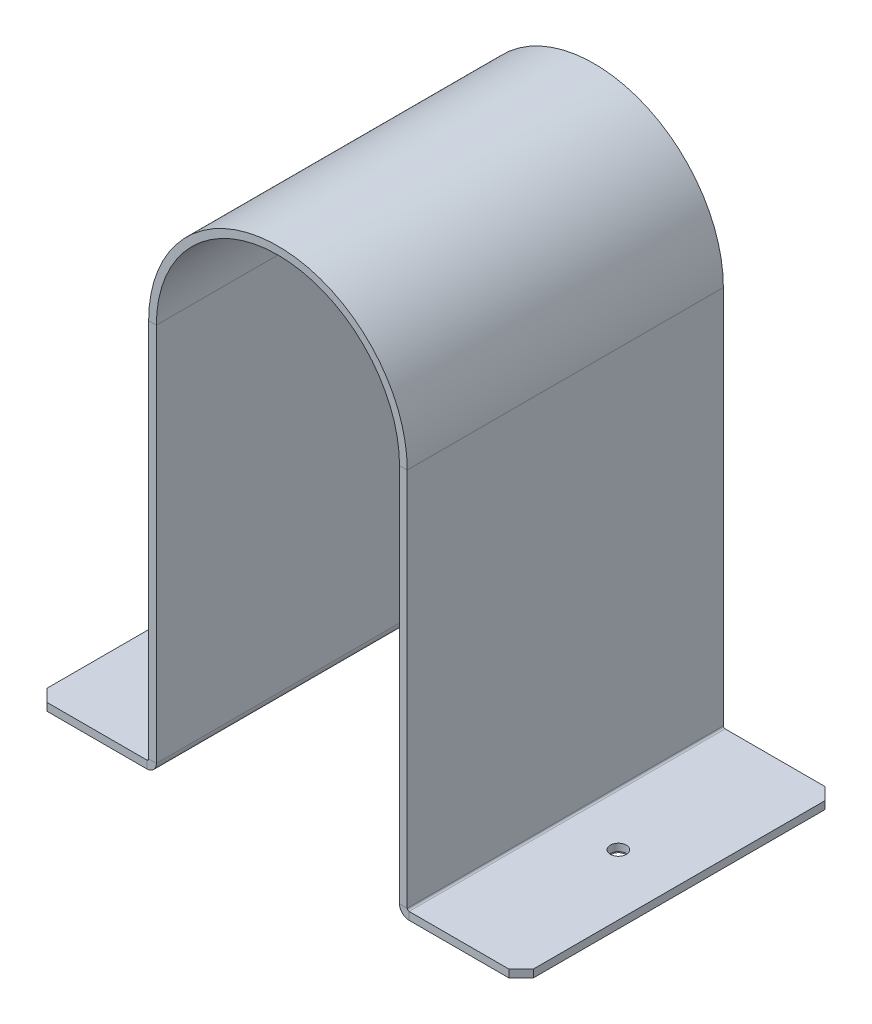
ISO-10303-21;
HEADER;
FILE_DESCRIPTION(('STEP AP214'),'2;1');
FILE_NAME('part.step','',(''),(''),'','','');
FILE_SCHEMA(('AUTOMOTIVE_DESIGN { 1 0 10303 214 1 1 1 1 }'));
ENDSEC;
DATA;
#1=APPLICATION_CONTEXT('core data for automotive mechanical design processes');
#2=APPLICATION_PROTOCOL_DEFINITION('international standard','automotive_design',2000,#1);
#3=PRODUCT_CONTEXT('',#1,'mechanical');
#4=PRODUCT('Part','Part','',(#3));
#5=PRODUCT_RELATED_PRODUCT_CATEGORY('part','',(#4));
#6=PRODUCT_DEFINITION_FORMATION('','',#4);
#7=PRODUCT_DEFINITION_CONTEXT('part definition',#1,'design');
#8=PRODUCT_DEFINITION('design','',#6,#7);
#9=PRODUCT_DEFINITION_SHAPE('','',#8);
#10=(LENGTH_UNIT() NAMED_UNIT(*) SI_UNIT(.MILLI.,.METRE.));
#11=(NAMED_UNIT(*) PLANE_ANGLE_UNIT() SI_UNIT($,.RADIAN.));
#12=(NAMED_UNIT(*) SI_UNIT($,.STERADIAN.) SOLID_ANGLE_UNIT());
#13=UNCERTAINTY_MEASURE_WITH_UNIT(LENGTH_MEASURE(1.E-05),#10,'distance_accuracy_value','');
#14=(GEOMETRIC_REPRESENTATION_CONTEXT(3) GLOBAL_UNCERTAINTY_ASSIGNED_CONTEXT((#13)) GLOBAL_UNIT_ASSIGNED_CONTEXT((#10,
#11,#12)) REPRESENTATION_CONTEXT('',''));
#15=CARTESIAN_POINT('',(0.,0.,0.));
#16=DIRECTION('',(0.,0.,1.));
#17=DIRECTION('',(1.,0.,0.));
#18=AXIS2_PLACEMENT_3D('',#15,#16,#17);
#19=CARTESIAN_POINT('',(-50.,160.,65.));
#20=DIRECTION('',(0.,0.,1.));
#21=DIRECTION('',(1.,0.,0.));
#22=AXIS2_PLACEMENT_3D('',#19,#20,#21);
#23=PLANE('',#22);
#24=DIRECTION('',(-1.,0.,0.));
#25=VECTOR('',#24,1.);
#26=CARTESIAN_POINT('',(-50.,160.,65.));
#27=LINE('',#26,#25);
#28=CARTESIAN_POINT('',(-50.,160.,65.));
#29=VERTEX_POINT('',#28);
#30=CARTESIAN_POINT('',(-53.175,160.,65.));
#31=VERTEX_POINT('',#30);
#32=EDGE_CURVE('E412',#29,#31,#27,.T.);
#33=ORIENTED_EDGE('',*,*,#32,.F.);
#34=CARTESIAN_POINT('',(0.,160.,65.));
#35=DIRECTION('',(0.,0.,-1.));
#36=DIRECTION('',(1.,0.,0.));
#37=AXIS2_PLACEMENT_3D('',#34,#35,#36);
#38=CIRCLE('',#37,50.);
#39=CARTESIAN_POINT('',(50.,160.,65.));
#40=VERTEX_POINT('',#39);
#41=EDGE_CURVE('E266',#29,#40,#38,.T.);
#42=ORIENTED_EDGE('',*,*,#41,.T.);
#43=DIRECTION('',(-1.,0.,0.));
#44=VECTOR('',#43,1.);
#45=CARTESIAN_POINT('',(53.175,160.,65.));
#46=LINE('',#45,#44);
#47=CARTESIAN_POINT('',(53.175,160.,65.));
#48=VERTEX_POINT('',#47);
#49=EDGE_CURVE('E409',#48,#40,#46,.T.);
#50=ORIENTED_EDGE('',*,*,#49,.F.);
#51=CARTESIAN_POINT('',(0.,160.,65.));
#52=DIRECTION('',(0.,0.,1.));
#53=DIRECTION('',(1.,0.,0.));
#54=AXIS2_PLACEMENT_3D('',#51,#52,#53);
#55=CIRCLE('',#54,53.175);
#56=EDGE_CURVE('E237',#31,#48,#55,.F.);
#57=ORIENTED_EDGE('',*,*,#56,.F.);
#58=EDGE_LOOP('',(#33,#42,#50,#57));
#59=FACE_BOUND('',#58,.T.);
#60=ADVANCED_FACE('F49',(#59),#23,.T.);
#61=CARTESIAN_POINT('',(53.175,160.,65.));
#62=DIRECTION('',(0.,0.,1.));
#63=DIRECTION('',(1.,0.,0.));
#64=AXIS2_PLACEMENT_3D('',#61,#62,#63);
#65=PLANE('',#64);
#66=DIRECTION('',(0.,1.,0.));
#67=VECTOR('',#66,1.);
#68=CARTESIAN_POINT('',(-50.,0.,65.));
#69=LINE('',#68,#67);
#70=CARTESIAN_POINT('',(-50.,3.9116,65.));
#71=VERTEX_POINT('',#70);
#72=EDGE_CURVE('E262',#71,#29,#69,.T.);
#73=ORIENTED_EDGE('',*,*,#72,.T.);
#74=ORIENTED_EDGE('',*,*,#32,.T.);
#75=DIRECTION('',(0.,1.,0.));
#76=VECTOR('',#75,1.);
#77=CARTESIAN_POINT('',(-53.175,0.,65.));
#78=LINE('',#77,#76);
#79=CARTESIAN_POINT('',(-53.175,3.9116,65.));
#80=VERTEX_POINT('',#79);
#81=EDGE_CURVE('E244',#80,#31,#78,.T.);
#82=ORIENTED_EDGE('',*,*,#81,.F.);
#83=DIRECTION('',(1.,0.,0.));
#84=VECTOR('',#83,1.);
#85=CARTESIAN_POINT('',(-53.175,3.9116,65.));
#86=LINE('',#85,#84);
#87=EDGE_CURVE('E396',#80,#71,#86,.T.);
#88=ORIENTED_EDGE('',*,*,#87,.T.);
#89=EDGE_LOOP('',(#73,#74,#82,#88));
#90=FACE_BOUND('',#89,.T.);
#91=ADVANCED_FACE('F514',(#90),#65,.T.);
#92=CARTESIAN_POINT('',(50.,160.,-65.));
#93=DIRECTION('',(0.,0.,-1.));
#94=DIRECTION('',(-1.,0.,0.));
#95=AXIS2_PLACEMENT_3D('',#92,#93,#94);
#96=PLANE('',#95);
#97=DIRECTION('',(1.,0.,0.));
#98=VECTOR('',#97,1.);
#99=CARTESIAN_POINT('',(50.,160.,-65.));
#100=LINE('',#99,#98);
#101=CARTESIAN_POINT('',(50.,160.,-65.));
#102=VERTEX_POINT('',#101);
#103=CARTESIAN_POINT('',(53.175,160.,-65.));
#104=VERTEX_POINT('',#103);
#105=EDGE_CURVE('E406',#102,#104,#100,.T.);
#106=ORIENTED_EDGE('',*,*,#105,.F.);
#107=CARTESIAN_POINT('',(0.,160.,-65.));
#108=DIRECTION('',(0.,0.,-1.));
#109=DIRECTION('',(1.,0.,0.));
#110=AXIS2_PLACEMENT_3D('',#107,#108,#109);
#111=CIRCLE('',#110,50.);
#112=CARTESIAN_POINT('',(-50.,160.,-65.));
#113=VERTEX_POINT('',#112);
#114=EDGE_CURVE('E317',#113,#102,#111,.T.);
#115=ORIENTED_EDGE('',*,*,#114,.F.);
#116=DIRECTION('',(1.,0.,0.));
#117=VECTOR('',#116,1.);
#118=CARTESIAN_POINT('',(-53.175,160.,-65.));
#119=LINE('',#118,#117);
#120=CARTESIAN_POINT('',(-53.175,160.,-65.));
#121=VERTEX_POINT('',#120);
#122=EDGE_CURVE('E403',#121,#113,#119,.T.);
#123=ORIENTED_EDGE('',*,*,#122,.F.);
#124=CARTESIAN_POINT('',(0.,160.,-65.));
#125=DIRECTION('',(0.,0.,1.));
#126=DIRECTION('',(1.,0.,0.));
#127=AXIS2_PLACEMENT_3D('',#124,#125,#126);
#128=CIRCLE('',#127,53.175);
#129=EDGE_CURVE('E291',#121,#104,#128,.F.);
#130=ORIENTED_EDGE('',*,*,#129,.T.);
#131=EDGE_LOOP('',(#106,#115,#123,#130));
#132=FACE_BOUND('',#131,.T.);
#133=ADVANCED_FACE('F520',(#132),#96,.T.);
#134=CARTESIAN_POINT('',(-53.175,160.,-65.));
#135=DIRECTION('',(0.,0.,-1.));
#136=DIRECTION('',(-1.,0.,0.));
#137=AXIS2_PLACEMENT_3D('',#134,#135,#136);
#138=PLANE('',#137);
#139=DIRECTION('',(0.,-1.,0.));
#140=VECTOR('',#139,1.);
#141=CARTESIAN_POINT('',(50.,160.,-65.));
#142=LINE('',#141,#140);
#143=CARTESIAN_POINT('',(50.,3.91159999999999,-65.));
#144=VERTEX_POINT('',#143);
#145=EDGE_CURVE('E321',#102,#144,#142,.T.);
#146=ORIENTED_EDGE('',*,*,#145,.F.);
#147=ORIENTED_EDGE('',*,*,#105,.T.);
#148=DIRECTION('',(0.,1.,0.));
#149=VECTOR('',#148,1.);
#150=CARTESIAN_POINT('',(53.175,160.,-65.));
#151=LINE('',#150,#149);
#152=CARTESIAN_POINT('',(53.175,3.91159999999999,-65.));
#153=VERTEX_POINT('',#152);
#154=EDGE_CURVE('E287',#104,#153,#151,.F.);
#155=ORIENTED_EDGE('',*,*,#154,.T.);
#156=DIRECTION('',(-1.,0.,0.));
#157=VECTOR('',#156,1.);
#158=CARTESIAN_POINT('',(53.175,3.91159999999999,-65.));
#159=LINE('',#158,#157);
#160=EDGE_CURVE('E382',#153,#144,#159,.T.);
#161=ORIENTED_EDGE('',*,*,#160,.T.);
#162=EDGE_LOOP('',(#146,#147,#155,#161));
#163=FACE_BOUND('',#162,.T.);
#164=ADVANCED_FACE('F607',(#163),#138,.T.);
#165=CARTESIAN_POINT('',(-53.9116,0.,65.));
#166=DIRECTION('',(0.,0.,1.));
#167=DIRECTION('',(1.,0.,0.));
#168=AXIS2_PLACEMENT_3D('',#165,#166,#167);
#169=PLANE('',#168);
#170=DIRECTION('',(0.,1.,0.));
#171=VECTOR('',#170,1.);
#172=CARTESIAN_POINT('',(-53.9116,0.,65.));
#173=LINE('',#172,#171);
#174=CARTESIAN_POINT('',(-53.9116,0.,65.));
#175=VERTEX_POINT('',#174);
#176=CARTESIAN_POINT('',(-53.9116,3.175,65.));
#177=VERTEX_POINT('',#176);
#178=EDGE_CURVE('E399',#175,#177,#173,.T.);
#179=ORIENTED_EDGE('',*,*,#178,.F.);
#180=CARTESIAN_POINT('',(-53.9116,3.9116,65.));
#181=DIRECTION('',(0.,0.,-1.));
#182=DIRECTION('',(-1.,0.,0.));
#183=AXIS2_PLACEMENT_3D('',#180,#181,#182);
#184=CIRCLE('',#183,3.9116);
#185=EDGE_CURVE('E258',#175,#71,#184,.F.);
#186=ORIENTED_EDGE('',*,*,#185,.T.);
#187=ORIENTED_EDGE('',*,*,#87,.F.);
#188=CARTESIAN_POINT('',(-53.9116,3.9116,65.));
#189=DIRECTION('',(0.,0.,1.));
#190=DIRECTION('',(1.,0.,0.));
#191=AXIS2_PLACEMENT_3D('',#188,#189,#190);
#192=CIRCLE('',#191,0.7366);
#193=EDGE_CURVE('E248',#177,#80,#192,.T.);
#194=ORIENTED_EDGE('',*,*,#193,.F.);
#195=EDGE_LOOP('',(#179,#186,#187,#194));
#196=FACE_BOUND('',#195,.T.);
#197=ADVANCED_FACE('F573',(#196),#169,.T.);
#198=CARTESIAN_POINT('',(-53.175,3.9116,65.));
#199=DIRECTION('',(0.,0.,1.));
#200=DIRECTION('',(1.,0.,0.));
#201=AXIS2_PLACEMENT_3D('',#198,#199,#200);
#202=PLANE('',#201);
#203=DIRECTION('',(1.,0.,0.));
#204=VECTOR('',#203,1.);
#205=CARTESIAN_POINT('',(-100.,3.175,65.));
#206=LINE('',#205,#204);
#207=CARTESIAN_POINT('',(-95.,3.175,65.));
#208=VERTEX_POINT('',#207);
#209=EDGE_CURVE('E252',#208,#177,#206,.T.);
#210=ORIENTED_EDGE('',*,*,#209,.F.);
#211=DIRECTION('',(0.,-1.,0.));
#212=VECTOR('',#211,1.);
#213=CARTESIAN_POINT('',(-95.,3.9116,65.));
#214=LINE('',#213,#212);
#215=CARTESIAN_POINT('',(-95.,0.,65.));
#216=VERTEX_POINT('',#215);
#217=EDGE_CURVE('E11',#208,#216,#214,.T.);
#218=ORIENTED_EDGE('',*,*,#217,.T.);
#219=DIRECTION('',(1.,0.,0.));
#220=VECTOR('',#219,1.);
#221=CARTESIAN_POINT('',(-100.,0.,65.));
#222=LINE('',#221,#220);
#223=EDGE_CURVE('E255',#216,#175,#222,.T.);
#224=ORIENTED_EDGE('',*,*,#223,.T.);
#225=ORIENTED_EDGE('',*,*,#178,.T.);
#226=EDGE_LOOP('',(#210,#218,#224,#225));
#227=FACE_BOUND('',#226,.T.);
#228=ADVANCED_FACE('F577',(#227),#202,.T.);
#229=CARTESIAN_POINT('',(-50.,3.9116,-65.));
#230=DIRECTION('',(0.,0.,-1.));
#231=DIRECTION('',(-1.,0.,0.));
#232=AXIS2_PLACEMENT_3D('',#229,#230,#231);
#233=PLANE('',#232);
#234=DIRECTION('',(-1.,0.,0.));
#235=VECTOR('',#234,1.);
#236=CARTESIAN_POINT('',(-50.,3.9116,-65.));
#237=LINE('',#236,#235);
#238=CARTESIAN_POINT('',(-50.,3.9116,-65.));
#239=VERTEX_POINT('',#238);
#240=CARTESIAN_POINT('',(-53.175,3.9116,-65.));
#241=VERTEX_POINT('',#240);
#242=EDGE_CURVE('E393',#239,#241,#237,.T.);
#243=ORIENTED_EDGE('',*,*,#242,.F.);
#244=CARTESIAN_POINT('',(-53.9116,3.9116,-65.));
#245=DIRECTION('',(0.,0.,-1.));
#246=DIRECTION('',(-1.,0.,0.));
#247=AXIS2_PLACEMENT_3D('',#244,#245,#246);
#248=CIRCLE('',#247,3.9116);
#249=CARTESIAN_POINT('',(-53.9116,0.,-65.));
#250=VERTEX_POINT('',#249);
#251=EDGE_CURVE('E309',#250,#239,#248,.F.);
#252=ORIENTED_EDGE('',*,*,#251,.F.);
#253=DIRECTION('',(0.,-1.,0.));
#254=VECTOR('',#253,1.);
#255=CARTESIAN_POINT('',(-53.9116,3.175,-65.));
#256=LINE('',#255,#254);
#257=CARTESIAN_POINT('',(-53.9116,3.175,-65.));
#258=VERTEX_POINT('',#257);
#259=EDGE_CURVE('E389',#258,#250,#256,.T.);
#260=ORIENTED_EDGE('',*,*,#259,.F.);
#261=CARTESIAN_POINT('',(-53.9116,3.9116,-65.));
#262=DIRECTION('',(0.,0.,1.));
#263=DIRECTION('',(1.,0.,0.));
#264=AXIS2_PLACEMENT_3D('',#261,#262,#263);
#265=CIRCLE('',#264,0.7366);
#266=EDGE_CURVE('E299',#258,#241,#265,.T.);
#267=ORIENTED_EDGE('',*,*,#266,.T.);
#268=EDGE_LOOP('',(#243,#252,#260,#267));
#269=FACE_BOUND('',#268,.T.);
#270=ADVANCED_FACE('F583',(#269),#233,.T.);
#271=CARTESIAN_POINT('',(-53.9116,3.175,-65.));
#272=DIRECTION('',(0.,0.,-1.));
#273=DIRECTION('',(-1.,0.,0.));
#274=AXIS2_PLACEMENT_3D('',#271,#272,#273);
#275=PLANE('',#274);
#276=DIRECTION('',(0.,1.,0.));
#277=VECTOR('',#276,1.);
#278=CARTESIAN_POINT('',(-50.,0.,-65.));
#279=LINE('',#278,#277);
#280=EDGE_CURVE('E313',#239,#113,#279,.T.);
#281=ORIENTED_EDGE('',*,*,#280,.F.);
#282=ORIENTED_EDGE('',*,*,#242,.T.);
#283=DIRECTION('',(0.,1.,0.));
#284=VECTOR('',#283,1.);
#285=CARTESIAN_POINT('',(-53.175,0.,-65.));
#286=LINE('',#285,#284);
#287=EDGE_CURVE('E295',#241,#121,#286,.T.);
#288=ORIENTED_EDGE('',*,*,#287,.T.);
#289=ORIENTED_EDGE('',*,*,#122,.T.);
#290=EDGE_LOOP('',(#281,#282,#288,#289));
#291=FACE_BOUND('',#290,.T.);
#292=ADVANCED_FACE('F589',(#291),#275,.T.);
#293=CARTESIAN_POINT('',(50.,3.91159999999999,65.));
#294=DIRECTION('',(0.,0.,1.));
#295=DIRECTION('',(1.,0.,0.));
#296=AXIS2_PLACEMENT_3D('',#293,#294,#295);
#297=PLANE('',#296);
#298=DIRECTION('',(1.,0.,0.));
#299=VECTOR('',#298,1.);
#300=CARTESIAN_POINT('',(50.,3.91159999999999,65.));
#301=LINE('',#300,#299);
#302=CARTESIAN_POINT('',(50.,3.91159999999999,65.));
#303=VERTEX_POINT('',#302);
#304=CARTESIAN_POINT('',(53.175,3.91159999999999,65.));
#305=VERTEX_POINT('',#304);
#306=EDGE_CURVE('E204',#303,#305,#301,.T.);
#307=ORIENTED_EDGE('',*,*,#306,.F.);
#308=CARTESIAN_POINT('',(53.9116,3.91159999999999,65.));
#309=DIRECTION('',(0.,0.,-1.));
#310=DIRECTION('',(-1.,0.,0.));
#311=AXIS2_PLACEMENT_3D('',#308,#309,#310);
#312=CIRCLE('',#311,3.9116);
#313=CARTESIAN_POINT('',(53.9116,0.,65.));
#314=VERTEX_POINT('',#313);
#315=EDGE_CURVE('E198',#303,#314,#312,.F.);
#316=ORIENTED_EDGE('',*,*,#315,.T.);
#317=DIRECTION('',(0.,-1.,0.));
#318=VECTOR('',#317,1.);
#319=CARTESIAN_POINT('',(53.9116,3.175,65.));
#320=LINE('',#319,#318);
#321=CARTESIAN_POINT('',(53.9116,3.175,65.));
#322=VERTEX_POINT('',#321);
#323=EDGE_CURVE('E191',#322,#314,#320,.T.);
#324=ORIENTED_EDGE('',*,*,#323,.F.);
#325=CARTESIAN_POINT('',(53.9116,3.91159999999999,65.));
#326=DIRECTION('',(0.,0.,1.));
#327=DIRECTION('',(1.,0.,0.));
#328=AXIS2_PLACEMENT_3D('',#325,#326,#327);
#329=CIRCLE('',#328,0.7366);
#330=EDGE_CURVE('E195',#305,#322,#329,.T.);
#331=ORIENTED_EDGE('',*,*,#330,.F.);
#332=EDGE_LOOP('',(#307,#316,#324,#331));
#333=FACE_BOUND('',#332,.T.);
#334=ADVANCED_FACE('F193',(#333),#297,.T.);
#335=CARTESIAN_POINT('',(53.9116,3.175,65.));
#336=DIRECTION('',(0.,0.,1.));
#337=DIRECTION('',(1.,0.,0.));
#338=AXIS2_PLACEMENT_3D('',#335,#336,#337);
#339=PLANE('',#338);
#340=DIRECTION('',(0.,-1.,0.));
#341=VECTOR('',#340,1.);
#342=CARTESIAN_POINT('',(50.,160.,65.));
#343=LINE('',#342,#341);
#344=EDGE_CURVE('E270',#40,#303,#343,.T.);
#345=ORIENTED_EDGE('',*,*,#344,.T.);
#346=ORIENTED_EDGE('',*,*,#306,.T.);
#347=DIRECTION('',(0.,1.,0.));
#348=VECTOR('',#347,1.);
#349=CARTESIAN_POINT('',(53.175,160.,65.));
#350=LINE('',#349,#348);
#351=EDGE_CURVE('E234',#48,#305,#350,.F.);
#352=ORIENTED_EDGE('',*,*,#351,.F.);
#353=ORIENTED_EDGE('',*,*,#49,.T.);
#354=EDGE_LOOP('',(#345,#346,#352,#353));
#355=FACE_BOUND('',#354,.T.);
#356=ADVANCED_FACE('F616',(#355),#339,.T.);
#357=CARTESIAN_POINT('',(53.9116,0.,-65.));
#358=DIRECTION('',(0.,0.,-1.));
#359=DIRECTION('',(-1.,0.,0.));
#360=AXIS2_PLACEMENT_3D('',#357,#358,#359);
#361=PLANE('',#360);
#362=DIRECTION('',(0.,1.,0.));
#363=VECTOR('',#362,1.);
#364=CARTESIAN_POINT('',(53.9116,0.,-65.));
#365=LINE('',#364,#363);
#366=CARTESIAN_POINT('',(53.9116,0.,-65.));
#367=VERTEX_POINT('',#366);
#368=CARTESIAN_POINT('',(53.9116,3.175,-65.));
#369=VERTEX_POINT('',#368);
#370=EDGE_CURVE('E205',#367,#369,#365,.T.);
#371=ORIENTED_EDGE('',*,*,#370,.F.);
#372=CARTESIAN_POINT('',(53.9116,3.91159999999999,-65.));
#373=DIRECTION('',(0.,0.,-1.));
#374=DIRECTION('',(-1.,0.,0.));
#375=AXIS2_PLACEMENT_3D('',#372,#373,#374);
#376=CIRCLE('',#375,3.9116);
#377=EDGE_CURVE('E325',#144,#367,#376,.F.);
#378=ORIENTED_EDGE('',*,*,#377,.F.);
#379=ORIENTED_EDGE('',*,*,#160,.F.);
#380=CARTESIAN_POINT('',(53.9116,3.91159999999999,-65.));
#381=DIRECTION('',(0.,0.,1.));
#382=DIRECTION('',(1.,0.,0.));
#383=AXIS2_PLACEMENT_3D('',#380,#381,#382);
#384=CIRCLE('',#383,0.7366);
#385=EDGE_CURVE('E284',#153,#369,#384,.T.);
#386=ORIENTED_EDGE('',*,*,#385,.T.);
#387=EDGE_LOOP('',(#371,#378,#379,#386));
#388=FACE_BOUND('',#387,.T.);
#389=ADVANCED_FACE('F496',(#388),#361,.T.);
#390=CARTESIAN_POINT('',(53.175,3.91159999999999,-65.));
#391=DIRECTION('',(0.,0.,-1.));
#392=DIRECTION('',(-1.,0.,0.));
#393=AXIS2_PLACEMENT_3D('',#390,#391,#392);
#394=PLANE('',#393);
#395=DIRECTION('',(1.,0.,0.));
#396=VECTOR('',#395,1.);
#397=CARTESIAN_POINT('',(50.,3.175,-65.));
#398=LINE('',#397,#396);
#399=CARTESIAN_POINT('',(95.,3.175,-65.));
#400=VERTEX_POINT('',#399);
#401=EDGE_CURVE('E217',#369,#400,#398,.T.);
#402=ORIENTED_EDGE('',*,*,#401,.T.);
#403=DIRECTION('',(0.,-1.,0.));
#404=VECTOR('',#403,1.);
#405=CARTESIAN_POINT('',(95.,3.91159999999999,-65.));
#406=LINE('',#405,#404);
#407=CARTESIAN_POINT('',(95.,0.,-65.));
#408=VERTEX_POINT('',#407);
#409=EDGE_CURVE('E415',#400,#408,#406,.T.);
#410=ORIENTED_EDGE('',*,*,#409,.T.);
#411=DIRECTION('',(1.,0.,0.));
#412=VECTOR('',#411,1.);
#413=CARTESIAN_POINT('',(50.,0.,-65.));
#414=LINE('',#413,#412);
#415=EDGE_CURVE('E277',#367,#408,#414,.T.);
#416=ORIENTED_EDGE('',*,*,#415,.F.);
#417=ORIENTED_EDGE('',*,*,#370,.T.);
#418=EDGE_LOOP('',(#402,#410,#416,#417));
#419=FACE_BOUND('',#418,.T.);
#420=ADVANCED_FACE('F492',(#419),#394,.T.);
#421=CARTESIAN_POINT('',(50.,0.,65.));
#422=DIRECTION('',(0.,1.,0.));
#423=DIRECTION('',(0.,0.,1.));
#424=AXIS2_PLACEMENT_3D('',#421,#422,#423);
#425=PLANE('',#424);
#426=CARTESIAN_POINT('',(75.,0.,0.));
#427=DIRECTION('',(0.,1.,0.));
#428=DIRECTION('',(0.,0.,1.));
#429=AXIS2_PLACEMENT_3D('',#426,#427,#428);
#430=CIRCLE('',#429,3.00875109058866);
#431=CARTESIAN_POINT('',(75.,0.,3.00875109058866));
#432=VERTEX_POINT('',#431);
#433=EDGE_CURVE('E54',#432,#432,#430,.T.);
#434=ORIENTED_EDGE('',*,*,#433,.T.);
#435=EDGE_LOOP('',(#434));
#436=FACE_BOUND('',#435,.T.);
#437=ORIENTED_EDGE('',*,*,#415,.T.);
#438=DIRECTION('',(-0.707106781186548,0.,-0.707106781186548));
#439=VECTOR('',#438,1.);
#440=CARTESIAN_POINT('',(95.,0.,-65.));
#441=LINE('',#440,#439);
#442=CARTESIAN_POINT('',(100.,0.,-60.));
#443=VERTEX_POINT('',#442);
#444=EDGE_CURVE('E422',#408,#443,#441,.F.);
#445=ORIENTED_EDGE('',*,*,#444,.T.);
#446=DIRECTION('',(0.,0.,-1.));
#447=VECTOR('',#446,1.);
#448=CARTESIAN_POINT('',(100.,0.,65.));
#449=LINE('',#448,#447);
#450=CARTESIAN_POINT('',(100.,0.,60.));
#451=VERTEX_POINT('',#450);
#452=EDGE_CURVE('E378',#451,#443,#449,.T.);
#453=ORIENTED_EDGE('',*,*,#452,.F.);
#454=DIRECTION('',(0.707106781186548,0.,-0.707106781186548));
#455=VECTOR('',#454,1.);
#456=CARTESIAN_POINT('',(100.,0.,60.));
#457=LINE('',#456,#455);
#458=CARTESIAN_POINT('',(95.,0.,65.));
#459=VERTEX_POINT('',#458);
#460=EDGE_CURVE('E419',#451,#459,#457,.F.);
#461=ORIENTED_EDGE('',*,*,#460,.T.);
#462=DIRECTION('',(1.,0.,0.));
#463=VECTOR('',#462,1.);
#464=CARTESIAN_POINT('',(50.,0.,65.));
#465=LINE('',#464,#463);
#466=EDGE_CURVE('E228',#314,#459,#465,.T.);
#467=ORIENTED_EDGE('',*,*,#466,.F.);
#468=DIRECTION('',(0.,0.,-1.));
#469=VECTOR('',#468,1.);
#470=CARTESIAN_POINT('',(53.9116,0.,65.));
#471=LINE('',#470,#469);
#472=EDGE_CURVE('E276',#314,#367,#471,.T.);
#473=ORIENTED_EDGE('',*,*,#472,.T.);
#474=EDGE_LOOP('',(#437,#445,#453,#461,#467,#473));
#475=FACE_BOUND('',#474,.T.);
#476=ADVANCED_FACE('F500',(#436,#475),#425,.F.);
#477=CARTESIAN_POINT('',(100.,3.175,65.));
#478=DIRECTION('',(1.,0.,0.));
#479=DIRECTION('',(0.,0.,-1.));
#480=AXIS2_PLACEMENT_3D('',#477,#478,#479);
#481=PLANE('',#480);
#482=ORIENTED_EDGE('',*,*,#452,.T.);
#483=DIRECTION('',(0.,1.,0.));
#484=VECTOR('',#483,1.);
#485=CARTESIAN_POINT('',(100.,3.175,-60.));
#486=LINE('',#485,#484);
#487=CARTESIAN_POINT('',(100.,3.175,-60.));
#488=VERTEX_POINT('',#487);
#489=EDGE_CURVE('E429',#443,#488,#486,.T.);
#490=ORIENTED_EDGE('',*,*,#489,.T.);
#491=DIRECTION('',(0.,0.,-1.));
#492=VECTOR('',#491,1.);
#493=CARTESIAN_POINT('',(100.,3.175,65.));
#494=LINE('',#493,#492);
#495=CARTESIAN_POINT('',(100.,3.175,60.));
#496=VERTEX_POINT('',#495);
#497=EDGE_CURVE('E222',#496,#488,#494,.T.);
#498=ORIENTED_EDGE('',*,*,#497,.F.);
#499=DIRECTION('',(0.,-1.,0.));
#500=VECTOR('',#499,1.);
#501=CARTESIAN_POINT('',(100.,3.175,60.));
#502=LINE('',#501,#500);
#503=EDGE_CURVE('E425',#496,#451,#502,.T.);
#504=ORIENTED_EDGE('',*,*,#503,.T.);
#505=EDGE_LOOP('',(#482,#490,#498,#504));
#506=FACE_BOUND('',#505,.T.);
#507=ADVANCED_FACE('F485',(#506),#481,.T.);
#508=CARTESIAN_POINT('',(50.,3.175,65.));
#509=DIRECTION('',(0.,1.,0.));
#510=DIRECTION('',(0.,0.,1.));
#511=AXIS2_PLACEMENT_3D('',#508,#509,#510);
#512=PLANE('',#511);
#513=CARTESIAN_POINT('',(75.,3.175,0.));
#514=DIRECTION('',(0.,1.,0.));
#515=DIRECTION('',(0.,0.,1.));
#516=AXIS2_PLACEMENT_3D('',#513,#514,#515);
#517=CIRCLE('',#516,3.3);
#518=CARTESIAN_POINT('',(75.,3.175,3.3));
#519=VERTEX_POINT('',#518);
#520=EDGE_CURVE('E908',#519,#519,#517,.T.);
#521=ORIENTED_EDGE('',*,*,#520,.F.);
#522=EDGE_LOOP('',(#521));
#523=FACE_BOUND('',#522,.T.);
#524=ORIENTED_EDGE('',*,*,#497,.T.);
#525=DIRECTION('',(0.707106781186548,0.,0.707106781186548));
#526=VECTOR('',#525,1.);
#527=CARTESIAN_POINT('',(137.5,3.175,-22.5));
#528=LINE('',#527,#526);
#529=EDGE_CURVE('E435',#488,#400,#528,.F.);
#530=ORIENTED_EDGE('',*,*,#529,.T.);
#531=ORIENTED_EDGE('',*,*,#401,.F.);
#532=DIRECTION('',(0.,0.,-1.));
#533=VECTOR('',#532,1.);
#534=CARTESIAN_POINT('',(53.9116,3.175,65.));
#535=LINE('',#534,#533);
#536=EDGE_CURVE('E211',#322,#369,#535,.T.);
#537=ORIENTED_EDGE('',*,*,#536,.F.);
#538=DIRECTION('',(1.,0.,0.));
#539=VECTOR('',#538,1.);
#540=CARTESIAN_POINT('',(50.,3.175,65.));
#541=LINE('',#540,#539);
#542=CARTESIAN_POINT('',(95.,3.175,65.));
#543=VERTEX_POINT('',#542);
#544=EDGE_CURVE('E214',#322,#543,#541,.T.);
#545=ORIENTED_EDGE('',*,*,#544,.T.);
#546=DIRECTION('',(-0.707106781186548,0.,0.707106781186548));
#547=VECTOR('',#546,1.);
#548=CARTESIAN_POINT('',(72.5,3.175,87.5));
#549=LINE('',#548,#547);
#550=EDGE_CURVE('E432',#543,#496,#549,.F.);
#551=ORIENTED_EDGE('',*,*,#550,.T.);
#552=EDGE_LOOP('',(#524,#530,#531,#537,#545,#551));
#553=FACE_BOUND('',#552,.T.);
#554=ADVANCED_FACE('F213',(#523,#553),#512,.T.);
#555=CARTESIAN_POINT('',(53.9116,3.91159999999999,65.));
#556=DIRECTION('',(0.,0.,-1.));
#557=DIRECTION('',(-1.,0.,0.));
#558=AXIS2_PLACEMENT_3D('',#555,#556,#557);
#559=CYLINDRICAL_SURFACE('',#558,0.7366);
#560=ORIENTED_EDGE('',*,*,#385,.F.);
#561=DIRECTION('',(0.,0.,-1.));
#562=VECTOR('',#561,1.);
#563=CARTESIAN_POINT('',(53.175,3.91159999999999,65.));
#564=LINE('',#563,#562);
#565=EDGE_CURVE('E223',#305,#153,#564,.T.);
#566=ORIENTED_EDGE('',*,*,#565,.F.);
#567=ORIENTED_EDGE('',*,*,#330,.T.);
#568=ORIENTED_EDGE('',*,*,#536,.T.);
#569=EDGE_LOOP('',(#560,#566,#567,#568));
#570=FACE_BOUND('',#569,.T.);
#571=ADVANCED_FACE('F231',(#570),#559,.F.);
#572=CARTESIAN_POINT('',(53.175,160.,65.));
#573=DIRECTION('',(1.,0.,0.));
#574=DIRECTION('',(0.,0.,-1.));
#575=AXIS2_PLACEMENT_3D('',#572,#573,#574);
#576=PLANE('',#575);
#577=ORIENTED_EDGE('',*,*,#154,.F.);
#578=DIRECTION('',(0.,0.,-1.));
#579=VECTOR('',#578,1.);
#580=CARTESIAN_POINT('',(53.175,160.,65.));
#581=LINE('',#580,#579);
#582=EDGE_CURVE('E370',#48,#104,#581,.T.);
#583=ORIENTED_EDGE('',*,*,#582,.F.);
#584=ORIENTED_EDGE('',*,*,#351,.T.);
#585=ORIENTED_EDGE('',*,*,#565,.T.);
#586=EDGE_LOOP('',(#577,#583,#584,#585));
#587=FACE_BOUND('',#586,.T.);
#588=ADVANCED_FACE('F604',(#587),#576,.T.);
#589=CARTESIAN_POINT('',(0.,160.,65.));
#590=DIRECTION('',(0.,0.,-1.));
#591=DIRECTION('',(-1.,0.,0.));
#592=AXIS2_PLACEMENT_3D('',#589,#590,#591);
#593=CYLINDRICAL_SURFACE('',#592,53.175);
#594=ORIENTED_EDGE('',*,*,#129,.F.);
#595=DIRECTION('',(0.,0.,-1.));
#596=VECTOR('',#595,1.);
#597=CARTESIAN_POINT('',(-53.175,160.,65.));
#598=LINE('',#597,#596);
#599=EDGE_CURVE('E366',#31,#121,#598,.T.);
#600=ORIENTED_EDGE('',*,*,#599,.F.);
#601=ORIENTED_EDGE('',*,*,#56,.T.);
#602=ORIENTED_EDGE('',*,*,#582,.T.);
#603=EDGE_LOOP('',(#594,#600,#601,#602));
#604=FACE_BOUND('',#603,.T.);
#605=ADVANCED_FACE('F599',(#604),#593,.T.);
#606=CARTESIAN_POINT('',(-53.175,0.,65.));
#607=DIRECTION('',(-1.,0.,0.));
#608=DIRECTION('',(0.,0.,1.));
#609=AXIS2_PLACEMENT_3D('',#606,#607,#608);
#610=PLANE('',#609);
#611=ORIENTED_EDGE('',*,*,#287,.F.);
#612=DIRECTION('',(0.,0.,-1.));
#613=VECTOR('',#612,1.);
#614=CARTESIAN_POINT('',(-53.175,3.9116,65.));
#615=LINE('',#614,#613);
#616=EDGE_CURVE('E362',#80,#241,#615,.T.);
#617=ORIENTED_EDGE('',*,*,#616,.F.);
#618=ORIENTED_EDGE('',*,*,#81,.T.);
#619=ORIENTED_EDGE('',*,*,#599,.T.);
#620=EDGE_LOOP('',(#611,#617,#618,#619));
#621=FACE_BOUND('',#620,.T.);
#622=ADVANCED_FACE('F595',(#621),#610,.T.);
#623=CARTESIAN_POINT('',(-53.9116,3.9116,65.));
#624=DIRECTION('',(0.,0.,-1.));
#625=DIRECTION('',(-1.,0.,0.));
#626=AXIS2_PLACEMENT_3D('',#623,#624,#625);
#627=CYLINDRICAL_SURFACE('',#626,0.7366);
#628=ORIENTED_EDGE('',*,*,#266,.F.);
#629=DIRECTION('',(0.,0.,-1.));
#630=VECTOR('',#629,1.);
#631=CARTESIAN_POINT('',(-53.9116,3.175,65.));
#632=LINE('',#631,#630);
#633=EDGE_CURVE('E358',#177,#258,#632,.T.);
#634=ORIENTED_EDGE('',*,*,#633,.F.);
#635=ORIENTED_EDGE('',*,*,#193,.T.);
#636=ORIENTED_EDGE('',*,*,#616,.T.);
#637=EDGE_LOOP('',(#628,#634,#635,#636));
#638=FACE_BOUND('',#637,.T.);
#639=ADVANCED_FACE('F580',(#638),#627,.F.);
#640=CARTESIAN_POINT('',(-100.,3.175,65.));
#641=DIRECTION('',(0.,1.,0.));
#642=DIRECTION('',(0.,0.,1.));
#643=AXIS2_PLACEMENT_3D('',#640,#641,#642);
#644=PLANE('',#643);
#645=CARTESIAN_POINT('',(-75.,3.175,0.));
#646=DIRECTION('',(0.,1.,0.));
#647=DIRECTION('',(0.,0.,1.));
#648=AXIS2_PLACEMENT_3D('',#645,#646,#647);
#649=CIRCLE('',#648,3.3);
#650=CARTESIAN_POINT('',(-75.,3.175,3.3));
#651=VERTEX_POINT('',#650);
#652=EDGE_CURVE('E468',#651,#651,#649,.T.);
#653=ORIENTED_EDGE('',*,*,#652,.F.);
#654=EDGE_LOOP('',(#653));
#655=FACE_BOUND('',#654,.T.);
#656=DIRECTION('',(1.,0.,0.));
#657=VECTOR('',#656,1.);
#658=CARTESIAN_POINT('',(-100.,3.175,-65.));
#659=LINE('',#658,#657);
#660=CARTESIAN_POINT('',(-95.,3.175,-65.));
#661=VERTEX_POINT('',#660);
#662=EDGE_CURVE('E303',#661,#258,#659,.T.);
#663=ORIENTED_EDGE('',*,*,#662,.F.);
#664=DIRECTION('',(-0.707106781186548,0.,0.707106781186548));
#665=VECTOR('',#664,1.);
#666=CARTESIAN_POINT('',(-162.5,3.175,2.5));
#667=LINE('',#666,#665);
#668=CARTESIAN_POINT('',(-100.,3.175,-60.));
#669=VERTEX_POINT('',#668);
#670=EDGE_CURVE('E445',#661,#669,#667,.T.);
#671=ORIENTED_EDGE('',*,*,#670,.T.);
#672=DIRECTION('',(0.,0.,-1.));
#673=VECTOR('',#672,1.);
#674=CARTESIAN_POINT('',(-100.,3.175,65.));
#675=LINE('',#674,#673);
#676=CARTESIAN_POINT('',(-100.,3.175,60.));
#677=VERTEX_POINT('',#676);
#678=EDGE_CURVE('E355',#677,#669,#675,.T.);
#679=ORIENTED_EDGE('',*,*,#678,.F.);
#680=DIRECTION('',(-0.707106781186548,0.,-0.707106781186548));
#681=VECTOR('',#680,1.);
#682=CARTESIAN_POINT('',(-97.5,3.175,62.5));
#683=LINE('',#682,#681);
#684=EDGE_CURVE('E442',#677,#208,#683,.F.);
#685=ORIENTED_EDGE('',*,*,#684,.T.);
#686=ORIENTED_EDGE('',*,*,#209,.T.);
#687=ORIENTED_EDGE('',*,*,#633,.T.);
#688=EDGE_LOOP('',(#663,#671,#679,#685,#686,#687));
#689=FACE_BOUND('',#688,.T.);
#690=ADVANCED_FACE('F560',(#655,#689),#644,.T.);
#691=CARTESIAN_POINT('',(-100.,0.,65.));
#692=DIRECTION('',(-1.,0.,0.));
#693=DIRECTION('',(0.,0.,1.));
#694=AXIS2_PLACEMENT_3D('',#691,#692,#693);
#695=PLANE('',#694);
#696=ORIENTED_EDGE('',*,*,#678,.T.);
#697=DIRECTION('',(0.,-1.,0.));
#698=VECTOR('',#697,1.);
#699=CARTESIAN_POINT('',(-100.,0.,-60.));
#700=LINE('',#699,#698);
#701=CARTESIAN_POINT('',(-100.,0.,-60.));
#702=VERTEX_POINT('',#701);
#703=EDGE_CURVE('E74',#669,#702,#700,.T.);
#704=ORIENTED_EDGE('',*,*,#703,.T.);
#705=DIRECTION('',(0.,0.,-1.));
#706=VECTOR('',#705,1.);
#707=CARTESIAN_POINT('',(-100.,0.,65.));
#708=LINE('',#707,#706);
#709=CARTESIAN_POINT('',(-100.,0.,60.));
#710=VERTEX_POINT('',#709);
#711=EDGE_CURVE('E352',#710,#702,#708,.T.);
#712=ORIENTED_EDGE('',*,*,#711,.F.);
#713=DIRECTION('',(0.,1.,0.));
#714=VECTOR('',#713,1.);
#715=CARTESIAN_POINT('',(-100.,0.,60.));
#716=LINE('',#715,#714);
#717=EDGE_CURVE('E448',#710,#677,#716,.T.);
#718=ORIENTED_EDGE('',*,*,#717,.T.);
#719=EDGE_LOOP('',(#696,#704,#712,#718));
#720=FACE_BOUND('',#719,.T.);
#721=ADVANCED_FACE('F556',(#720),#695,.T.);
#722=CARTESIAN_POINT('',(-100.,0.,65.));
#723=DIRECTION('',(0.,1.,0.));
#724=DIRECTION('',(0.,0.,1.));
#725=AXIS2_PLACEMENT_3D('',#722,#723,#724);
#726=PLANE('',#725);
#727=CARTESIAN_POINT('',(-75.,0.,0.));
#728=DIRECTION('',(0.,1.,0.));
#729=DIRECTION('',(0.,0.,1.));
#730=AXIS2_PLACEMENT_3D('',#727,#728,#729);
#731=CIRCLE('',#730,3.00875109058866);
#732=CARTESIAN_POINT('',(-75.,0.,3.00875109058866));
#733=VERTEX_POINT('',#732);
#734=EDGE_CURVE('E281',#733,#733,#731,.T.);
#735=ORIENTED_EDGE('',*,*,#734,.T.);
#736=EDGE_LOOP('',(#735));
#737=FACE_BOUND('',#736,.T.);
#738=ORIENTED_EDGE('',*,*,#711,.T.);
#739=DIRECTION('',(0.707106781186548,0.,-0.707106781186548));
#740=VECTOR('',#739,1.);
#741=CARTESIAN_POINT('',(-95.,0.,-65.));
#742=LINE('',#741,#740);
#743=CARTESIAN_POINT('',(-95.,0.,-65.));
#744=VERTEX_POINT('',#743);
#745=EDGE_CURVE('E457',#702,#744,#742,.T.);
#746=ORIENTED_EDGE('',*,*,#745,.T.);
#747=DIRECTION('',(1.,0.,0.));
#748=VECTOR('',#747,1.);
#749=CARTESIAN_POINT('',(-100.,0.,-65.));
#750=LINE('',#749,#748);
#751=EDGE_CURVE('E306',#744,#250,#750,.T.);
#752=ORIENTED_EDGE('',*,*,#751,.T.);
#753=DIRECTION('',(0.,0.,-1.));
#754=VECTOR('',#753,1.);
#755=CARTESIAN_POINT('',(-53.9116,0.,65.));
#756=LINE('',#755,#754);
#757=EDGE_CURVE('E348',#175,#250,#756,.T.);
#758=ORIENTED_EDGE('',*,*,#757,.F.);
#759=ORIENTED_EDGE('',*,*,#223,.F.);
#760=DIRECTION('',(0.707106781186548,0.,0.707106781186548));
#761=VECTOR('',#760,1.);
#762=CARTESIAN_POINT('',(-100.,0.,60.));
#763=LINE('',#762,#761);
#764=EDGE_CURVE('E454',#216,#710,#763,.F.);
#765=ORIENTED_EDGE('',*,*,#764,.T.);
#766=EDGE_LOOP('',(#738,#746,#752,#758,#759,#765));
#767=FACE_BOUND('',#766,.T.);
#768=ADVANCED_FACE('F553',(#737,#767),#726,.F.);
#769=CARTESIAN_POINT('',(-53.9116,3.9116,65.));
#770=DIRECTION('',(0.,0.,-1.));
#771=DIRECTION('',(-1.,0.,0.));
#772=AXIS2_PLACEMENT_3D('',#769,#770,#771);
#773=CYLINDRICAL_SURFACE('',#772,3.9116);
#774=ORIENTED_EDGE('',*,*,#251,.T.);
#775=DIRECTION('',(0.,0.,-1.));
#776=VECTOR('',#775,1.);
#777=CARTESIAN_POINT('',(-50.,3.9116,65.));
#778=LINE('',#777,#776);
#779=EDGE_CURVE('E344',#71,#239,#778,.T.);
#780=ORIENTED_EDGE('',*,*,#779,.F.);
#781=ORIENTED_EDGE('',*,*,#185,.F.);
#782=ORIENTED_EDGE('',*,*,#757,.T.);
#783=EDGE_LOOP('',(#774,#780,#781,#782));
#784=FACE_BOUND('',#783,.T.);
#785=ADVANCED_FACE('F569',(#784),#773,.T.);
#786=CARTESIAN_POINT('',(-50.,0.,65.));
#787=DIRECTION('',(-1.,0.,0.));
#788=DIRECTION('',(0.,0.,1.));
#789=AXIS2_PLACEMENT_3D('',#786,#787,#788);
#790=PLANE('',#789);
#791=ORIENTED_EDGE('',*,*,#280,.T.);
#792=DIRECTION('',(0.,0.,-1.));
#793=VECTOR('',#792,1.);
#794=CARTESIAN_POINT('',(-50.,160.,65.));
#795=LINE('',#794,#793);
#796=EDGE_CURVE('E340',#29,#113,#795,.T.);
#797=ORIENTED_EDGE('',*,*,#796,.F.);
#798=ORIENTED_EDGE('',*,*,#72,.F.);
#799=ORIENTED_EDGE('',*,*,#779,.T.);
#800=EDGE_LOOP('',(#791,#797,#798,#799));
#801=FACE_BOUND('',#800,.T.);
#802=ADVANCED_FACE('F586',(#801),#790,.F.);
#803=CARTESIAN_POINT('',(0.,160.,65.));
#804=DIRECTION('',(0.,0.,-1.));
#805=DIRECTION('',(-1.,0.,0.));
#806=AXIS2_PLACEMENT_3D('',#803,#804,#805);
#807=CYLINDRICAL_SURFACE('',#806,50.);
#808=ORIENTED_EDGE('',*,*,#114,.T.);
#809=DIRECTION('',(0.,0.,-1.));
#810=VECTOR('',#809,1.);
#811=CARTESIAN_POINT('',(50.,160.,65.));
#812=LINE('',#811,#810);
#813=EDGE_CURVE('E336',#40,#102,#812,.T.);
#814=ORIENTED_EDGE('',*,*,#813,.F.);
#815=ORIENTED_EDGE('',*,*,#41,.F.);
#816=ORIENTED_EDGE('',*,*,#796,.T.);
#817=EDGE_LOOP('',(#808,#814,#815,#816));
#818=FACE_BOUND('',#817,.T.);
#819=ADVANCED_FACE('F610',(#818),#807,.F.);
#820=CARTESIAN_POINT('',(50.,160.,65.));
#821=DIRECTION('',(1.,0.,0.));
#822=DIRECTION('',(0.,0.,-1.));
#823=AXIS2_PLACEMENT_3D('',#820,#821,#822);
#824=PLANE('',#823);
#825=ORIENTED_EDGE('',*,*,#145,.T.);
#826=DIRECTION('',(0.,0.,-1.));
#827=VECTOR('',#826,1.);
#828=CARTESIAN_POINT('',(50.,3.91159999999999,65.));
#829=LINE('',#828,#827);
#830=EDGE_CURVE('E332',#303,#144,#829,.T.);
#831=ORIENTED_EDGE('',*,*,#830,.F.);
#832=ORIENTED_EDGE('',*,*,#344,.F.);
#833=ORIENTED_EDGE('',*,*,#813,.T.);
#834=EDGE_LOOP('',(#825,#831,#832,#833));
#835=FACE_BOUND('',#834,.T.);
#836=ADVANCED_FACE('F614',(#835),#824,.F.);
#837=CARTESIAN_POINT('',(53.9116,3.91159999999999,65.));
#838=DIRECTION('',(0.,0.,-1.));
#839=DIRECTION('',(-1.,0.,0.));
#840=AXIS2_PLACEMENT_3D('',#837,#838,#839);
#841=CYLINDRICAL_SURFACE('',#840,3.9116);
#842=ORIENTED_EDGE('',*,*,#377,.T.);
#843=ORIENTED_EDGE('',*,*,#472,.F.);
#844=ORIENTED_EDGE('',*,*,#315,.F.);
#845=ORIENTED_EDGE('',*,*,#830,.T.);
#846=EDGE_LOOP('',(#842,#843,#844,#845));
#847=FACE_BOUND('',#846,.T.);
#848=ADVANCED_FACE('F498',(#847),#841,.T.);
#849=CARTESIAN_POINT('',(53.9116,3.91159999999999,65.));
#850=DIRECTION('',(0.,0.,1.));
#851=DIRECTION('',(1.,0.,0.));
#852=AXIS2_PLACEMENT_3D('',#849,#850,#851);
#853=PLANE('',#852);
#854=ORIENTED_EDGE('',*,*,#466,.T.);
#855=DIRECTION('',(0.,1.,0.));
#856=VECTOR('',#855,1.);
#857=CARTESIAN_POINT('',(95.,3.91159999999999,65.));
#858=LINE('',#857,#856);
#859=EDGE_CURVE('E60',#459,#543,#858,.T.);
#860=ORIENTED_EDGE('',*,*,#859,.T.);
#861=ORIENTED_EDGE('',*,*,#544,.F.);
#862=ORIENTED_EDGE('',*,*,#323,.T.);
#863=EDGE_LOOP('',(#854,#860,#861,#862));
#864=FACE_BOUND('',#863,.T.);
#865=ADVANCED_FACE('F225',(#864),#853,.T.);
#866=CARTESIAN_POINT('',(53.9116,3.91159999999999,-65.));
#867=DIRECTION('',(0.,0.,1.));
#868=DIRECTION('',(1.,0.,0.));
#869=AXIS2_PLACEMENT_3D('',#866,#867,#868);
#870=PLANE('',#869);
#871=ORIENTED_EDGE('',*,*,#751,.F.);
#872=DIRECTION('',(0.,1.,0.));
#873=VECTOR('',#872,1.);
#874=CARTESIAN_POINT('',(-95.,3.175,-65.));
#875=LINE('',#874,#873);
#876=EDGE_CURVE('E438',#744,#661,#875,.T.);
#877=ORIENTED_EDGE('',*,*,#876,.T.);
#878=ORIENTED_EDGE('',*,*,#662,.T.);
#879=ORIENTED_EDGE('',*,*,#259,.T.);
#880=EDGE_LOOP('',(#871,#877,#878,#879));
#881=FACE_BOUND('',#880,.T.);
#882=ADVANCED_FACE('F532',(#881),#870,.F.);
#883=CARTESIAN_POINT('',(95.,3.91159999999999,-65.));
#884=DIRECTION('',(-0.707106781186547,0.,0.707106781186547));
#885=DIRECTION('',(0.,-1.,0.));
#886=AXIS2_PLACEMENT_3D('',#883,#884,#885);
#887=PLANE('',#886);
#888=ORIENTED_EDGE('',*,*,#529,.F.);
#889=ORIENTED_EDGE('',*,*,#489,.F.);
#890=ORIENTED_EDGE('',*,*,#444,.F.);
#891=ORIENTED_EDGE('',*,*,#409,.F.);
#892=EDGE_LOOP('',(#888,#889,#890,#891));
#893=FACE_BOUND('',#892,.T.);
#894=ADVANCED_FACE('F489',(#893),#887,.F.);
#895=CARTESIAN_POINT('',(-95.,3.91159999999999,-65.));
#896=DIRECTION('',(-0.707106781186547,0.,-0.707106781186547));
#897=DIRECTION('',(0.,-1.,0.));
#898=AXIS2_PLACEMENT_3D('',#895,#896,#897);
#899=PLANE('',#898);
#900=ORIENTED_EDGE('',*,*,#745,.F.);
#901=ORIENTED_EDGE('',*,*,#703,.F.);
#902=ORIENTED_EDGE('',*,*,#670,.F.);
#903=ORIENTED_EDGE('',*,*,#876,.F.);
#904=EDGE_LOOP('',(#900,#901,#902,#903));
#905=FACE_BOUND('',#904,.T.);
#906=ADVANCED_FACE('F531',(#905),#899,.T.);
#907=CARTESIAN_POINT('',(100.,3.175,60.));
#908=DIRECTION('',(-0.707106781186547,0.,-0.707106781186547));
#909=DIRECTION('',(0.,-1.,0.));
#910=AXIS2_PLACEMENT_3D('',#907,#908,#909);
#911=PLANE('',#910);
#912=ORIENTED_EDGE('',*,*,#550,.F.);
#913=ORIENTED_EDGE('',*,*,#859,.F.);
#914=ORIENTED_EDGE('',*,*,#460,.F.);
#915=ORIENTED_EDGE('',*,*,#503,.F.);
#916=EDGE_LOOP('',(#912,#913,#914,#915));
#917=FACE_BOUND('',#916,.T.);
#918=ADVANCED_FACE('F480',(#917),#911,.F.);
#919=CARTESIAN_POINT('',(-100.,0.,60.));
#920=DIRECTION('',(0.707106781186547,0.,-0.707106781186547));
#921=DIRECTION('',(0.,1.,0.));
#922=AXIS2_PLACEMENT_3D('',#919,#920,#921);
#923=PLANE('',#922);
#924=ORIENTED_EDGE('',*,*,#764,.F.);
#925=ORIENTED_EDGE('',*,*,#217,.F.);
#926=ORIENTED_EDGE('',*,*,#684,.F.);
#927=ORIENTED_EDGE('',*,*,#717,.F.);
#928=EDGE_LOOP('',(#924,#925,#926,#927));
#929=FACE_BOUND('',#928,.T.);
#930=ADVANCED_FACE('F52',(#929),#923,.F.);
#931=CARTESIAN_POINT('',(-75.,0.174999999999999,0.));
#932=DIRECTION('',(0.,1.,0.));
#933=DIRECTION('',(0.,0.,1.));
#934=AXIS2_PLACEMENT_3D('',#931,#932,#933);
#935=CONICAL_SURFACE('',#934,3.3,1.02974425867665);
#936=CARTESIAN_POINT('',(-75.,0.174999999999999,0.));
#937=DIRECTION('',(0.,1.,0.));
#938=DIRECTION('',(0.,0.,1.));
#939=AXIS2_PLACEMENT_3D('',#936,#937,#938);
#940=CIRCLE('',#939,3.3);
#941=CARTESIAN_POINT('',(-75.,0.174999999999999,3.3));
#942=VERTEX_POINT('',#941);
#943=EDGE_CURVE('E463',#942,#942,#940,.T.);
#944=ORIENTED_EDGE('',*,*,#943,.T.);
#945=EDGE_LOOP('',(#944));
#946=FACE_BOUND('',#945,.T.);
#947=ORIENTED_EDGE('',*,*,#734,.F.);
#948=EDGE_LOOP('',(#947));
#949=FACE_BOUND('',#948,.T.);
#950=ADVANCED_FACE('F543',(#946,#949),#935,.F.);
#951=CARTESIAN_POINT('',(-75.,3.175,0.));
#952=DIRECTION('',(0.,1.,0.));
#953=DIRECTION('',(0.,0.,1.));
#954=AXIS2_PLACEMENT_3D('',#951,#952,#953);
#955=CYLINDRICAL_SURFACE('',#954,3.3);
#956=ORIENTED_EDGE('',*,*,#943,.F.);
#957=EDGE_LOOP('',(#956));
#958=FACE_BOUND('',#957,.T.);
#959=ORIENTED_EDGE('',*,*,#652,.T.);
#960=EDGE_LOOP('',(#959));
#961=FACE_BOUND('',#960,.T.);
#962=ADVANCED_FACE('F548',(#958,#961),#955,.F.);
#963=CARTESIAN_POINT('',(75.,0.174999999999999,0.));
#964=DIRECTION('',(0.,1.,0.));
#965=DIRECTION('',(0.,0.,1.));
#966=AXIS2_PLACEMENT_3D('',#963,#964,#965);
#967=CONICAL_SURFACE('',#966,3.3,1.02974425867665);
#968=CARTESIAN_POINT('',(75.,0.174999999999999,0.));
#969=DIRECTION('',(0.,1.,0.));
#970=DIRECTION('',(0.,0.,1.));
#971=AXIS2_PLACEMENT_3D('',#968,#969,#970);
#972=CIRCLE('',#971,3.3);
#973=CARTESIAN_POINT('',(75.,0.174999999999999,3.3));
#974=VERTEX_POINT('',#973);
#975=EDGE_CURVE('E905',#974,#974,#972,.T.);
#976=ORIENTED_EDGE('',*,*,#975,.T.);
#977=EDGE_LOOP('',(#976));
#978=FACE_BOUND('',#977,.T.);
#979=ORIENTED_EDGE('',*,*,#433,.F.);
#980=EDGE_LOOP('',(#979));
#981=FACE_BOUND('',#980,.T.);
#982=ADVANCED_FACE('F879',(#978,#981),#967,.F.);
#983=CARTESIAN_POINT('',(75.,3.175,0.));
#984=DIRECTION('',(0.,1.,0.));
#985=DIRECTION('',(0.,0.,1.));
#986=AXIS2_PLACEMENT_3D('',#983,#984,#985);
#987=CYLINDRICAL_SURFACE('',#986,3.3);
#988=ORIENTED_EDGE('',*,*,#975,.F.);
#989=EDGE_LOOP('',(#988));
#990=FACE_BOUND('',#989,.T.);
#991=ORIENTED_EDGE('',*,*,#520,.T.);
#992=EDGE_LOOP('',(#991));
#993=FACE_BOUND('',#992,.T.);
#994=ADVANCED_FACE('F889',(#990,#993),#987,.F.);
#995=CLOSED_SHELL('',(#60,#91,#133,#164,#197,#228,#270,#292,#334,#356,#389,#420,#476,#507,#554,
#571,#588,#605,#622,#639,#690,#721,#768,#785,#802,#819,#836,#848,#865,#882,#894,#906,#918,#930,
#950,#962,#982,#994));
#996=MANIFOLD_SOLID_BREP('B2',#995);
#997=ADVANCED_BREP_SHAPE_REPRESENTATION('',(#18,#996),#14);
#998=SHAPE_DEFINITION_REPRESENTATION(#9,#997);
ENDSEC;
END-ISO-10303-21;
